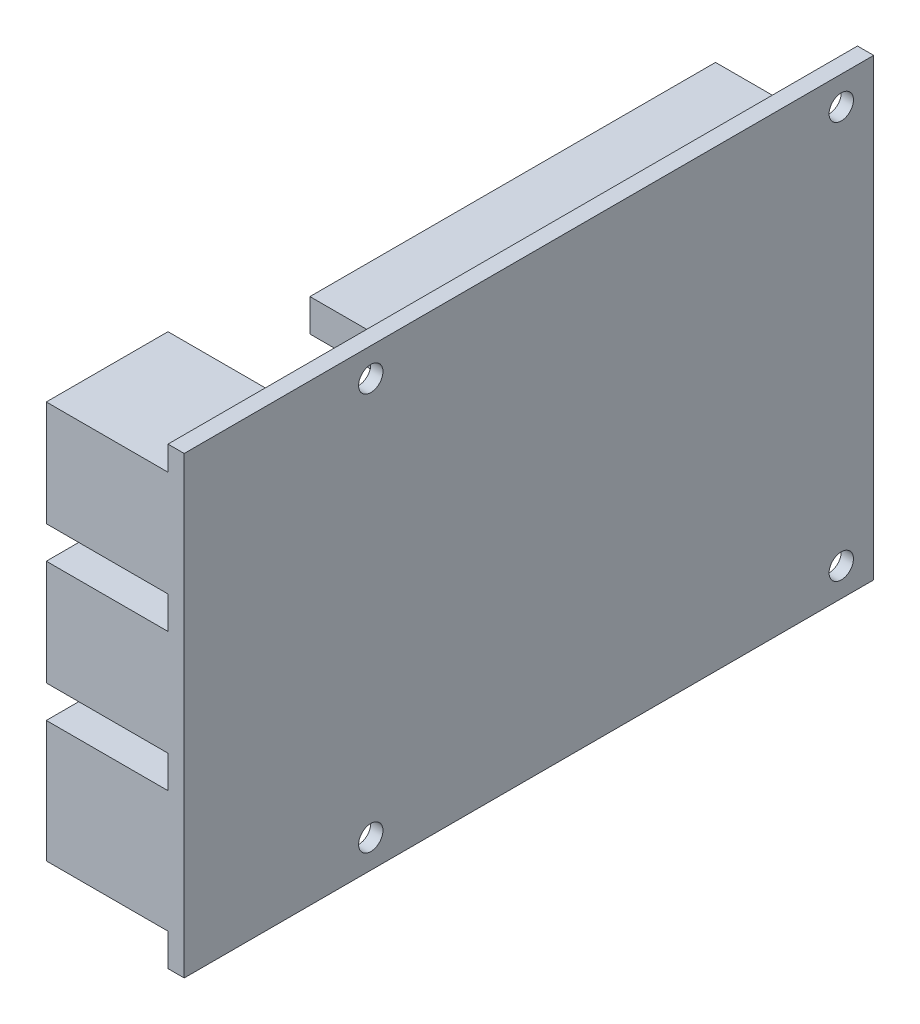
ISO-10303-21;
HEADER;
FILE_DESCRIPTION(('STEP AP214'),'2;1');
FILE_NAME('part.step','',(''),(''),'','','');
FILE_SCHEMA(('AUTOMOTIVE_DESIGN { 1 0 10303 214 1 1 1 1 }'));
ENDSEC;
DATA;
#1=APPLICATION_CONTEXT('core data for automotive mechanical design processes');
#2=APPLICATION_PROTOCOL_DEFINITION('international standard','automotive_design',2000,#1);
#3=PRODUCT_CONTEXT('',#1,'mechanical');
#4=PRODUCT('Part','Part','',(#3));
#5=PRODUCT_RELATED_PRODUCT_CATEGORY('part','',(#4));
#6=PRODUCT_DEFINITION_FORMATION('','',#4);
#7=PRODUCT_DEFINITION_CONTEXT('part definition',#1,'design');
#8=PRODUCT_DEFINITION('design','',#6,#7);
#9=PRODUCT_DEFINITION_SHAPE('','',#8);
#10=(LENGTH_UNIT() NAMED_UNIT(*) SI_UNIT(.MILLI.,.METRE.));
#11=(NAMED_UNIT(*) PLANE_ANGLE_UNIT() SI_UNIT($,.RADIAN.));
#12=(NAMED_UNIT(*) SI_UNIT($,.STERADIAN.) SOLID_ANGLE_UNIT());
#13=UNCERTAINTY_MEASURE_WITH_UNIT(LENGTH_MEASURE(1.E-05),#10,'distance_accuracy_value','');
#14=(GEOMETRIC_REPRESENTATION_CONTEXT(3) GLOBAL_UNCERTAINTY_ASSIGNED_CONTEXT((#13)) GLOBAL_UNIT_ASSIGNED_CONTEXT((#10,
#11,#12)) REPRESENTATION_CONTEXT('',''));
#15=CARTESIAN_POINT('',(0.,0.,0.));
#16=DIRECTION('',(0.,0.,1.));
#17=DIRECTION('',(1.,0.,0.));
#18=AXIS2_PLACEMENT_3D('',#15,#16,#17);
#19=CARTESIAN_POINT('',(0.,0.,0.));
#20=DIRECTION('',(-1.,0.,0.));
#21=DIRECTION('',(0.,0.,1.));
#22=AXIS2_PLACEMENT_3D('',#19,#20,#21);
#23=PLANE('',#22);
#24=CARTESIAN_POINT('',(0.,-24.5,19.5));
#25=DIRECTION('',(-1.,0.,0.));
#26=DIRECTION('',(0.,0.,-1.));
#27=AXIS2_PLACEMENT_3D('',#24,#25,#26);
#28=CIRCLE('',#27,2.5);
#29=CARTESIAN_POINT('',(0.,-24.5,17.));
#30=VERTEX_POINT('',#29);
#31=EDGE_CURVE('E199',#30,#30,#28,.T.);
#32=ORIENTED_EDGE('',*,*,#31,.F.);
#33=EDGE_LOOP('',(#32));
#34=FACE_BOUND('',#33,.T.);
#35=CARTESIAN_POINT('',(0.,-24.5,-38.5));
#36=DIRECTION('',(-1.,0.,0.));
#37=DIRECTION('',(0.,0.,-1.));
#38=AXIS2_PLACEMENT_3D('',#35,#36,#37);
#39=CIRCLE('',#38,2.5);
#40=CARTESIAN_POINT('',(0.,-24.5,-41.));
#41=VERTEX_POINT('',#40);
#42=EDGE_CURVE('E217',#41,#41,#39,.T.);
#43=ORIENTED_EDGE('',*,*,#42,.F.);
#44=EDGE_LOOP('',(#43));
#45=FACE_BOUND('',#44,.T.);
#46=CARTESIAN_POINT('',(0.,24.5,-38.5));
#47=DIRECTION('',(-1.,0.,0.));
#48=DIRECTION('',(0.,0.,1.));
#49=AXIS2_PLACEMENT_3D('',#46,#47,#48);
#50=CIRCLE('',#49,2.5);
#51=CARTESIAN_POINT('',(0.,24.5,-36.));
#52=VERTEX_POINT('',#51);
#53=EDGE_CURVE('E211',#52,#52,#50,.T.);
#54=ORIENTED_EDGE('',*,*,#53,.F.);
#55=EDGE_LOOP('',(#54));
#56=FACE_BOUND('',#55,.T.);
#57=CARTESIAN_POINT('',(0.,24.5,19.5));
#58=DIRECTION('',(-1.,0.,0.));
#59=DIRECTION('',(0.,0.,1.));
#60=AXIS2_PLACEMENT_3D('',#57,#58,#59);
#61=CIRCLE('',#60,2.5);
#62=CARTESIAN_POINT('',(0.,24.5,22.));
#63=VERTEX_POINT('',#62);
#64=EDGE_CURVE('E210',#63,#63,#61,.T.);
#65=ORIENTED_EDGE('',*,*,#64,.F.);
#66=EDGE_LOOP('',(#65));
#67=FACE_BOUND('',#66,.T.);
#68=DIRECTION('',(0.,1.,0.));
#69=VECTOR('',#68,1.);
#70=CARTESIAN_POINT('',(0.,12.,27.5));
#71=LINE('',#70,#69);
#72=CARTESIAN_POINT('',(0.,12.,27.5));
#73=VERTEX_POINT('',#72);
#74=CARTESIAN_POINT('',(0.,25.,27.5));
#75=VERTEX_POINT('',#74);
#76=EDGE_CURVE('E239',#73,#75,#71,.T.);
#77=ORIENTED_EDGE('',*,*,#76,.T.);
#78=DIRECTION('',(0.,0.,-1.));
#79=VECTOR('',#78,1.);
#80=CARTESIAN_POINT('',(0.,25.,42.5));
#81=LINE('',#80,#79);
#82=CARTESIAN_POINT('',(0.,25.,42.5));
#83=VERTEX_POINT('',#82);
#84=EDGE_CURVE('E243',#83,#75,#81,.T.);
#85=ORIENTED_EDGE('',*,*,#84,.F.);
#86=DIRECTION('',(0.,-1.,0.));
#87=VECTOR('',#86,1.);
#88=CARTESIAN_POINT('',(0.,-28.,42.5));
#89=LINE('',#88,#87);
#90=CARTESIAN_POINT('',(0.,28.,42.5));
#91=VERTEX_POINT('',#90);
#92=EDGE_CURVE('E328',#91,#83,#89,.T.);
#93=ORIENTED_EDGE('',*,*,#92,.F.);
#94=DIRECTION('',(0.,0.,1.));
#95=VECTOR('',#94,1.);
#96=CARTESIAN_POINT('',(0.,28.,42.5));
#97=LINE('',#96,#95);
#98=CARTESIAN_POINT('',(0.,28.,-42.5));
#99=VERTEX_POINT('',#98);
#100=EDGE_CURVE('E325',#99,#91,#97,.T.);
#101=ORIENTED_EDGE('',*,*,#100,.F.);
#102=DIRECTION('',(0.,1.,0.));
#103=VECTOR('',#102,1.);
#104=CARTESIAN_POINT('',(0.,-28.,-42.5));
#105=LINE('',#104,#103);
#106=CARTESIAN_POINT('',(0.,-28.,-42.5));
#107=VERTEX_POINT('',#106);
#108=EDGE_CURVE('E311',#107,#99,#105,.T.);
#109=ORIENTED_EDGE('',*,*,#108,.F.);
#110=DIRECTION('',(0.,0.,-1.));
#111=VECTOR('',#110,1.);
#112=CARTESIAN_POINT('',(0.,-28.,42.5));
#113=LINE('',#112,#111);
#114=CARTESIAN_POINT('',(0.,-28.,42.5));
#115=VERTEX_POINT('',#114);
#116=EDGE_CURVE('E316',#115,#107,#113,.T.);
#117=ORIENTED_EDGE('',*,*,#116,.F.);
#118=CARTESIAN_POINT('',(0.,-24.,42.5));
#119=VERTEX_POINT('',#118);
#120=EDGE_CURVE('E327',#119,#115,#89,.T.);
#121=ORIENTED_EDGE('',*,*,#120,.F.);
#122=DIRECTION('',(0.,0.,-1.));
#123=VECTOR('',#122,1.);
#124=CARTESIAN_POINT('',(0.,-24.,42.5));
#125=LINE('',#124,#123);
#126=CARTESIAN_POINT('',(0.,-24.,22.5));
#127=VERTEX_POINT('',#126);
#128=EDGE_CURVE('E287',#119,#127,#125,.T.);
#129=ORIENTED_EDGE('',*,*,#128,.T.);
#130=DIRECTION('',(0.,1.,0.));
#131=VECTOR('',#130,1.);
#132=CARTESIAN_POINT('',(0.,-24.,22.5));
#133=LINE('',#132,#131);
#134=CARTESIAN_POINT('',(0.,-8.99999999999999,22.5));
#135=VERTEX_POINT('',#134);
#136=EDGE_CURVE('E297',#127,#135,#133,.T.);
#137=ORIENTED_EDGE('',*,*,#136,.T.);
#138=DIRECTION('',(0.,0.,-1.));
#139=VECTOR('',#138,1.);
#140=CARTESIAN_POINT('',(0.,-8.99999999999999,42.5));
#141=LINE('',#140,#139);
#142=CARTESIAN_POINT('',(0.,-8.99999999999999,42.5));
#143=VERTEX_POINT('',#142);
#144=EDGE_CURVE('E275',#143,#135,#141,.T.);
#145=ORIENTED_EDGE('',*,*,#144,.F.);
#146=CARTESIAN_POINT('',(0.,-4.99999999999999,42.5));
#147=VERTEX_POINT('',#146);
#148=EDGE_CURVE('E466',#147,#143,#89,.T.);
#149=ORIENTED_EDGE('',*,*,#148,.F.);
#150=DIRECTION('',(0.,0.,-1.));
#151=VECTOR('',#150,1.);
#152=CARTESIAN_POINT('',(0.,-4.99999999999999,42.5));
#153=LINE('',#152,#151);
#154=CARTESIAN_POINT('',(0.,-4.99999999999999,27.5));
#155=VERTEX_POINT('',#154);
#156=EDGE_CURVE('E265',#147,#155,#153,.T.);
#157=ORIENTED_EDGE('',*,*,#156,.T.);
#158=DIRECTION('',(0.,1.,0.));
#159=VECTOR('',#158,1.);
#160=CARTESIAN_POINT('',(0.,-4.99999999999999,27.5));
#161=LINE('',#160,#159);
#162=CARTESIAN_POINT('',(0.,8.00000000000001,27.5));
#163=VERTEX_POINT('',#162);
#164=EDGE_CURVE('E268',#155,#163,#161,.T.);
#165=ORIENTED_EDGE('',*,*,#164,.T.);
#166=DIRECTION('',(0.,0.,-1.));
#167=VECTOR('',#166,1.);
#168=CARTESIAN_POINT('',(0.,8.00000000000001,42.5));
#169=LINE('',#168,#167);
#170=CARTESIAN_POINT('',(0.,8.00000000000001,42.5));
#171=VERTEX_POINT('',#170);
#172=EDGE_CURVE('E272',#171,#163,#169,.T.);
#173=ORIENTED_EDGE('',*,*,#172,.F.);
#174=CARTESIAN_POINT('',(0.,12.,42.5));
#175=VERTEX_POINT('',#174);
#176=EDGE_CURVE('E331',#175,#171,#89,.T.);
#177=ORIENTED_EDGE('',*,*,#176,.F.);
#178=DIRECTION('',(0.,0.,-1.));
#179=VECTOR('',#178,1.);
#180=CARTESIAN_POINT('',(0.,12.,42.5));
#181=LINE('',#180,#179);
#182=EDGE_CURVE('E60',#175,#73,#181,.T.);
#183=ORIENTED_EDGE('',*,*,#182,.T.);
#184=EDGE_LOOP('',(#77,#85,#93,#101,#109,#117,#121,#129,#137,#145,#149,#157,#165,#173,#177,#183));
#185=FACE_BOUND('',#184,.T.);
#186=DIRECTION('',(0.,0.,-1.));
#187=VECTOR('',#186,1.);
#188=CARTESIAN_POINT('',(0.,26.,16.));
#189=LINE('',#188,#187);
#190=CARTESIAN_POINT('',(0.,26.,16.));
#191=VERTEX_POINT('',#190);
#192=CARTESIAN_POINT('',(0.,26.,-34.));
#193=VERTEX_POINT('',#192);
#194=EDGE_CURVE('E490',#191,#193,#189,.T.);
#195=ORIENTED_EDGE('',*,*,#194,.F.);
#196=DIRECTION('',(0.,1.,0.));
#197=VECTOR('',#196,1.);
#198=CARTESIAN_POINT('',(0.,22.,16.));
#199=LINE('',#198,#197);
#200=CARTESIAN_POINT('',(0.,22.,16.));
#201=VERTEX_POINT('',#200);
#202=EDGE_CURVE('E197',#201,#191,#199,.T.);
#203=ORIENTED_EDGE('',*,*,#202,.F.);
#204=DIRECTION('',(0.,0.,1.));
#205=VECTOR('',#204,1.);
#206=CARTESIAN_POINT('',(0.,22.,16.));
#207=LINE('',#206,#205);
#208=CARTESIAN_POINT('',(0.,22.,-34.));
#209=VERTEX_POINT('',#208);
#210=EDGE_CURVE('E193',#209,#201,#207,.T.);
#211=ORIENTED_EDGE('',*,*,#210,.F.);
#212=DIRECTION('',(0.,-1.,0.));
#213=VECTOR('',#212,1.);
#214=CARTESIAN_POINT('',(0.,22.,-34.));
#215=LINE('',#214,#213);
#216=EDGE_CURVE('E492',#193,#209,#215,.T.);
#217=ORIENTED_EDGE('',*,*,#216,.F.);
#218=EDGE_LOOP('',(#195,#203,#211,#217));
#219=FACE_BOUND('',#218,.T.);
#220=ADVANCED_FACE('F35',(#34,#45,#56,#67,#185,#219),#23,.T.);
#221=CARTESIAN_POINT('',(15.,24.5,-38.5));
#222=DIRECTION('',(-1.,0.,0.));
#223=DIRECTION('',(0.,0.,1.));
#224=AXIS2_PLACEMENT_3D('',#221,#222,#223);
#225=CYLINDRICAL_SURFACE('',#224,1.5);
#226=CARTESIAN_POINT('',(2.,24.5,-38.5));
#227=DIRECTION('',(-1.,0.,0.));
#228=DIRECTION('',(0.,0.,1.));
#229=AXIS2_PLACEMENT_3D('',#226,#227,#228);
#230=CIRCLE('',#229,1.5);
#231=CARTESIAN_POINT('',(2.,24.5,-37.));
#232=VERTEX_POINT('',#231);
#233=EDGE_CURVE('E340',#232,#232,#230,.T.);
#234=ORIENTED_EDGE('',*,*,#233,.F.);
#235=EDGE_LOOP('',(#234));
#236=FACE_BOUND('',#235,.T.);
#237=CARTESIAN_POINT('',(0.5,24.5,-38.5));
#238=DIRECTION('',(-1.,0.,0.));
#239=DIRECTION('',(0.,0.,1.));
#240=AXIS2_PLACEMENT_3D('',#237,#238,#239);
#241=CIRCLE('',#240,1.5);
#242=CARTESIAN_POINT('',(0.5,24.5,-37.));
#243=VERTEX_POINT('',#242);
#244=EDGE_CURVE('E39',#243,#243,#241,.F.);
#245=ORIENTED_EDGE('',*,*,#244,.F.);
#246=EDGE_LOOP('',(#245));
#247=FACE_BOUND('',#246,.T.);
#248=ADVANCED_FACE('F364',(#236,#247),#225,.F.);
#249=CARTESIAN_POINT('',(15.,24.5,19.5));
#250=DIRECTION('',(-1.,0.,0.));
#251=DIRECTION('',(0.,0.,1.));
#252=AXIS2_PLACEMENT_3D('',#249,#250,#251);
#253=CYLINDRICAL_SURFACE('',#252,1.5);
#254=CARTESIAN_POINT('',(2.,24.5,19.5));
#255=DIRECTION('',(-1.,0.,0.));
#256=DIRECTION('',(0.,0.,1.));
#257=AXIS2_PLACEMENT_3D('',#254,#255,#256);
#258=CIRCLE('',#257,1.5);
#259=CARTESIAN_POINT('',(2.,24.5,21.));
#260=VERTEX_POINT('',#259);
#261=EDGE_CURVE('E231',#260,#260,#258,.T.);
#262=ORIENTED_EDGE('',*,*,#261,.F.);
#263=EDGE_LOOP('',(#262));
#264=FACE_BOUND('',#263,.T.);
#265=CARTESIAN_POINT('',(0.5,24.5,19.5));
#266=DIRECTION('',(-1.,0.,0.));
#267=DIRECTION('',(0.,0.,1.));
#268=AXIS2_PLACEMENT_3D('',#265,#266,#267);
#269=CIRCLE('',#268,1.5);
#270=CARTESIAN_POINT('',(0.5,24.5,21.));
#271=VERTEX_POINT('',#270);
#272=EDGE_CURVE('E225',#271,#271,#269,.F.);
#273=ORIENTED_EDGE('',*,*,#272,.F.);
#274=EDGE_LOOP('',(#273));
#275=FACE_BOUND('',#274,.T.);
#276=ADVANCED_FACE('F366',(#264,#275),#253,.F.);
#277=CARTESIAN_POINT('',(2.,-28.,-42.5));
#278=DIRECTION('',(0.,0.,1.));
#279=DIRECTION('',(1.,0.,0.));
#280=AXIS2_PLACEMENT_3D('',#277,#278,#279);
#281=PLANE('',#280);
#282=ORIENTED_EDGE('',*,*,#108,.T.);
#283=DIRECTION('',(-1.,0.,0.));
#284=VECTOR('',#283,1.);
#285=CARTESIAN_POINT('',(2.,28.,-42.5));
#286=LINE('',#285,#284);
#287=CARTESIAN_POINT('',(2.,28.,-42.5));
#288=VERTEX_POINT('',#287);
#289=EDGE_CURVE('E11',#288,#99,#286,.T.);
#290=ORIENTED_EDGE('',*,*,#289,.F.);
#291=DIRECTION('',(0.,1.,0.));
#292=VECTOR('',#291,1.);
#293=CARTESIAN_POINT('',(2.,-28.,-42.5));
#294=LINE('',#293,#292);
#295=CARTESIAN_POINT('',(2.,-28.,-42.5));
#296=VERTEX_POINT('',#295);
#297=EDGE_CURVE('E312',#296,#288,#294,.T.);
#298=ORIENTED_EDGE('',*,*,#297,.F.);
#299=DIRECTION('',(-1.,0.,0.));
#300=VECTOR('',#299,1.);
#301=CARTESIAN_POINT('',(2.,-28.,-42.5));
#302=LINE('',#301,#300);
#303=EDGE_CURVE('E322',#296,#107,#302,.T.);
#304=ORIENTED_EDGE('',*,*,#303,.T.);
#305=EDGE_LOOP('',(#282,#290,#298,#304));
#306=FACE_BOUND('',#305,.T.);
#307=ADVANCED_FACE('F37',(#306),#281,.F.);
#308=CARTESIAN_POINT('',(2.,28.,42.5));
#309=DIRECTION('',(0.,-1.,0.));
#310=DIRECTION('',(0.,0.,-1.));
#311=AXIS2_PLACEMENT_3D('',#308,#309,#310);
#312=PLANE('',#311);
#313=ORIENTED_EDGE('',*,*,#100,.T.);
#314=DIRECTION('',(-1.,0.,0.));
#315=VECTOR('',#314,1.);
#316=CARTESIAN_POINT('',(2.,28.,42.5));
#317=LINE('',#316,#315);
#318=CARTESIAN_POINT('',(2.,28.,42.5));
#319=VERTEX_POINT('',#318);
#320=EDGE_CURVE('E44',#319,#91,#317,.T.);
#321=ORIENTED_EDGE('',*,*,#320,.F.);
#322=DIRECTION('',(0.,0.,1.));
#323=VECTOR('',#322,1.);
#324=CARTESIAN_POINT('',(2.,28.,42.5));
#325=LINE('',#324,#323);
#326=EDGE_CURVE('E315',#288,#319,#325,.T.);
#327=ORIENTED_EDGE('',*,*,#326,.F.);
#328=ORIENTED_EDGE('',*,*,#289,.T.);
#329=EDGE_LOOP('',(#313,#321,#327,#328));
#330=FACE_BOUND('',#329,.T.);
#331=ADVANCED_FACE('F439',(#330),#312,.F.);
#332=CARTESIAN_POINT('',(2.,-28.,42.5));
#333=DIRECTION('',(0.,0.,-1.));
#334=DIRECTION('',(-1.,0.,0.));
#335=AXIS2_PLACEMENT_3D('',#332,#333,#334);
#336=PLANE('',#335);
#337=ORIENTED_EDGE('',*,*,#92,.T.);
#338=DIRECTION('',(1.,0.,0.));
#339=VECTOR('',#338,1.);
#340=CARTESIAN_POINT('',(-15.,25.,42.5));
#341=LINE('',#340,#339);
#342=CARTESIAN_POINT('',(-15.,25.,42.5));
#343=VERTEX_POINT('',#342);
#344=EDGE_CURVE('E235',#343,#83,#341,.T.);
#345=ORIENTED_EDGE('',*,*,#344,.F.);
#346=DIRECTION('',(0.,1.,0.));
#347=VECTOR('',#346,1.);
#348=CARTESIAN_POINT('',(-15.,12.,42.5));
#349=LINE('',#348,#347);
#350=CARTESIAN_POINT('',(-15.,12.,42.5));
#351=VERTEX_POINT('',#350);
#352=EDGE_CURVE('E237',#351,#343,#349,.T.);
#353=ORIENTED_EDGE('',*,*,#352,.F.);
#354=DIRECTION('',(1.,0.,0.));
#355=VECTOR('',#354,1.);
#356=CARTESIAN_POINT('',(-15.,12.,42.5));
#357=LINE('',#356,#355);
#358=EDGE_CURVE('E233',#351,#175,#357,.T.);
#359=ORIENTED_EDGE('',*,*,#358,.T.);
#360=ORIENTED_EDGE('',*,*,#176,.T.);
#361=DIRECTION('',(1.,0.,0.));
#362=VECTOR('',#361,1.);
#363=CARTESIAN_POINT('',(-15.,8.00000000000001,42.5));
#364=LINE('',#363,#362);
#365=CARTESIAN_POINT('',(-15.,8.00000000000001,42.5));
#366=VERTEX_POINT('',#365);
#367=EDGE_CURVE('E261',#366,#171,#364,.T.);
#368=ORIENTED_EDGE('',*,*,#367,.F.);
#369=DIRECTION('',(0.,1.,0.));
#370=VECTOR('',#369,1.);
#371=CARTESIAN_POINT('',(-15.,-4.99999999999999,42.5));
#372=LINE('',#371,#370);
#373=CARTESIAN_POINT('',(-15.,-4.99999999999999,42.5));
#374=VERTEX_POINT('',#373);
#375=EDGE_CURVE('E264',#374,#366,#372,.T.);
#376=ORIENTED_EDGE('',*,*,#375,.F.);
#377=DIRECTION('',(1.,0.,0.));
#378=VECTOR('',#377,1.);
#379=CARTESIAN_POINT('',(-15.,-4.99999999999999,42.5));
#380=LINE('',#379,#378);
#381=EDGE_CURVE('E258',#374,#147,#380,.T.);
#382=ORIENTED_EDGE('',*,*,#381,.T.);
#383=ORIENTED_EDGE('',*,*,#148,.T.);
#384=DIRECTION('',(1.,0.,0.));
#385=VECTOR('',#384,1.);
#386=CARTESIAN_POINT('',(-15.,-8.99999999999999,42.5));
#387=LINE('',#386,#385);
#388=CARTESIAN_POINT('',(-15.,-8.99999999999999,42.5));
#389=VERTEX_POINT('',#388);
#390=EDGE_CURVE('E295',#389,#143,#387,.T.);
#391=ORIENTED_EDGE('',*,*,#390,.F.);
#392=DIRECTION('',(0.,1.,0.));
#393=VECTOR('',#392,1.);
#394=CARTESIAN_POINT('',(-15.,-24.,42.5));
#395=LINE('',#394,#393);
#396=CARTESIAN_POINT('',(-15.,-24.,42.5));
#397=VERTEX_POINT('',#396);
#398=EDGE_CURVE('E293',#397,#389,#395,.T.);
#399=ORIENTED_EDGE('',*,*,#398,.F.);
#400=DIRECTION('',(1.,0.,0.));
#401=VECTOR('',#400,1.);
#402=CARTESIAN_POINT('',(-15.,-24.,42.5));
#403=LINE('',#402,#401);
#404=EDGE_CURVE('E304',#397,#119,#403,.T.);
#405=ORIENTED_EDGE('',*,*,#404,.T.);
#406=ORIENTED_EDGE('',*,*,#120,.T.);
#407=DIRECTION('',(-1.,0.,0.));
#408=VECTOR('',#407,1.);
#409=CARTESIAN_POINT('',(2.,-28.,42.5));
#410=LINE('',#409,#408);
#411=CARTESIAN_POINT('',(2.,-28.,42.5));
#412=VERTEX_POINT('',#411);
#413=EDGE_CURVE('E335',#412,#115,#410,.T.);
#414=ORIENTED_EDGE('',*,*,#413,.F.);
#415=DIRECTION('',(0.,-1.,0.));
#416=VECTOR('',#415,1.);
#417=CARTESIAN_POINT('',(2.,-28.,42.5));
#418=LINE('',#417,#416);
#419=EDGE_CURVE('E318',#319,#412,#418,.T.);
#420=ORIENTED_EDGE('',*,*,#419,.F.);
#421=ORIENTED_EDGE('',*,*,#320,.T.);
#422=EDGE_LOOP('',(#337,#345,#353,#359,#360,#368,#376,#382,#383,#391,#399,#405,#406,#414,#420,#421));
#423=FACE_BOUND('',#422,.T.);
#424=ADVANCED_FACE('F436',(#423),#336,.F.);
#425=CARTESIAN_POINT('',(2.,-28.,42.5));
#426=DIRECTION('',(0.,1.,0.));
#427=DIRECTION('',(0.,0.,1.));
#428=AXIS2_PLACEMENT_3D('',#425,#426,#427);
#429=PLANE('',#428);
#430=ORIENTED_EDGE('',*,*,#116,.T.);
#431=ORIENTED_EDGE('',*,*,#303,.F.);
#432=DIRECTION('',(0.,0.,-1.));
#433=VECTOR('',#432,1.);
#434=CARTESIAN_POINT('',(2.,-28.,42.5));
#435=LINE('',#434,#433);
#436=EDGE_CURVE('E320',#412,#296,#435,.T.);
#437=ORIENTED_EDGE('',*,*,#436,.F.);
#438=ORIENTED_EDGE('',*,*,#413,.T.);
#439=EDGE_LOOP('',(#430,#431,#437,#438));
#440=FACE_BOUND('',#439,.T.);
#441=ADVANCED_FACE('F431',(#440),#429,.F.);
#442=CARTESIAN_POINT('',(2.,0.,0.));
#443=DIRECTION('',(-1.,0.,0.));
#444=DIRECTION('',(0.,0.,1.));
#445=AXIS2_PLACEMENT_3D('',#442,#443,#444);
#446=PLANE('',#445);
#447=ORIENTED_EDGE('',*,*,#261,.T.);
#448=EDGE_LOOP('',(#447));
#449=FACE_BOUND('',#448,.T.);
#450=CARTESIAN_POINT('',(2.,-24.5,-38.5));
#451=DIRECTION('',(-1.,0.,0.));
#452=DIRECTION('',(0.,0.,1.));
#453=AXIS2_PLACEMENT_3D('',#450,#451,#452);
#454=CIRCLE('',#453,1.5);
#455=CARTESIAN_POINT('',(2.,-24.5,-37.));
#456=VERTEX_POINT('',#455);
#457=EDGE_CURVE('E346',#456,#456,#454,.T.);
#458=ORIENTED_EDGE('',*,*,#457,.T.);
#459=EDGE_LOOP('',(#458));
#460=FACE_BOUND('',#459,.T.);
#461=CARTESIAN_POINT('',(2.,-24.5,19.5));
#462=DIRECTION('',(-1.,0.,0.));
#463=DIRECTION('',(0.,0.,1.));
#464=AXIS2_PLACEMENT_3D('',#461,#462,#463);
#465=CIRCLE('',#464,1.5);
#466=CARTESIAN_POINT('',(2.,-24.5,21.));
#467=VERTEX_POINT('',#466);
#468=EDGE_CURVE('E343',#467,#467,#465,.T.);
#469=ORIENTED_EDGE('',*,*,#468,.T.);
#470=EDGE_LOOP('',(#469));
#471=FACE_BOUND('',#470,.T.);
#472=ORIENTED_EDGE('',*,*,#233,.T.);
#473=EDGE_LOOP('',(#472));
#474=FACE_BOUND('',#473,.T.);
#475=ORIENTED_EDGE('',*,*,#297,.T.);
#476=ORIENTED_EDGE('',*,*,#326,.T.);
#477=ORIENTED_EDGE('',*,*,#419,.T.);
#478=ORIENTED_EDGE('',*,*,#436,.T.);
#479=EDGE_LOOP('',(#475,#476,#477,#478));
#480=FACE_BOUND('',#479,.T.);
#481=ADVANCED_FACE('F428',(#449,#460,#471,#474,#480),#446,.F.);
#482=CARTESIAN_POINT('',(-15.,-8.99999999999999,42.5));
#483=DIRECTION('',(0.,-1.,0.));
#484=DIRECTION('',(0.,0.,-1.));
#485=AXIS2_PLACEMENT_3D('',#482,#483,#484);
#486=PLANE('',#485);
#487=ORIENTED_EDGE('',*,*,#144,.T.);
#488=DIRECTION('',(1.,0.,0.));
#489=VECTOR('',#488,1.);
#490=CARTESIAN_POINT('',(-15.,-8.99999999999999,22.5));
#491=LINE('',#490,#489);
#492=CARTESIAN_POINT('',(-15.,-8.99999999999999,22.5));
#493=VERTEX_POINT('',#492);
#494=EDGE_CURVE('E308',#493,#135,#491,.T.);
#495=ORIENTED_EDGE('',*,*,#494,.F.);
#496=DIRECTION('',(0.,0.,-1.));
#497=VECTOR('',#496,1.);
#498=CARTESIAN_POINT('',(-15.,-8.99999999999999,42.5));
#499=LINE('',#498,#497);
#500=EDGE_CURVE('E284',#389,#493,#499,.T.);
#501=ORIENTED_EDGE('',*,*,#500,.F.);
#502=ORIENTED_EDGE('',*,*,#390,.T.);
#503=EDGE_LOOP('',(#487,#495,#501,#502));
#504=FACE_BOUND('',#503,.T.);
#505=ADVANCED_FACE('F424',(#504),#486,.F.);
#506=CARTESIAN_POINT('',(-15.,-24.,22.5));
#507=DIRECTION('',(0.,0.,-1.));
#508=DIRECTION('',(-1.,0.,0.));
#509=AXIS2_PLACEMENT_3D('',#506,#507,#508);
#510=PLANE('',#509);
#511=ORIENTED_EDGE('',*,*,#136,.F.);
#512=DIRECTION('',(1.,0.,0.));
#513=VECTOR('',#512,1.);
#514=CARTESIAN_POINT('',(-15.,-24.,22.5));
#515=LINE('',#514,#513);
#516=CARTESIAN_POINT('',(-15.,-24.,22.5));
#517=VERTEX_POINT('',#516);
#518=EDGE_CURVE('E306',#517,#127,#515,.T.);
#519=ORIENTED_EDGE('',*,*,#518,.F.);
#520=DIRECTION('',(0.,1.,0.));
#521=VECTOR('',#520,1.);
#522=CARTESIAN_POINT('',(-15.,-24.,22.5));
#523=LINE('',#522,#521);
#524=EDGE_CURVE('E286',#517,#493,#523,.T.);
#525=ORIENTED_EDGE('',*,*,#524,.T.);
#526=ORIENTED_EDGE('',*,*,#494,.T.);
#527=EDGE_LOOP('',(#511,#519,#525,#526));
#528=FACE_BOUND('',#527,.T.);
#529=ADVANCED_FACE('F420',(#528),#510,.T.);
#530=CARTESIAN_POINT('',(-15.,-24.,42.5));
#531=DIRECTION('',(0.,-1.,0.));
#532=DIRECTION('',(0.,0.,-1.));
#533=AXIS2_PLACEMENT_3D('',#530,#531,#532);
#534=PLANE('',#533);
#535=ORIENTED_EDGE('',*,*,#128,.F.);
#536=ORIENTED_EDGE('',*,*,#404,.F.);
#537=DIRECTION('',(0.,0.,-1.));
#538=VECTOR('',#537,1.);
#539=CARTESIAN_POINT('',(-15.,-24.,42.5));
#540=LINE('',#539,#538);
#541=EDGE_CURVE('E290',#397,#517,#540,.T.);
#542=ORIENTED_EDGE('',*,*,#541,.T.);
#543=ORIENTED_EDGE('',*,*,#518,.T.);
#544=EDGE_LOOP('',(#535,#536,#542,#543));
#545=FACE_BOUND('',#544,.T.);
#546=ADVANCED_FACE('F416',(#545),#534,.T.);
#547=CARTESIAN_POINT('',(-15.,0.,0.));
#548=DIRECTION('',(1.,0.,0.));
#549=DIRECTION('',(0.,0.,-1.));
#550=AXIS2_PLACEMENT_3D('',#547,#548,#549);
#551=PLANE('',#550);
#552=ORIENTED_EDGE('',*,*,#500,.T.);
#553=ORIENTED_EDGE('',*,*,#524,.F.);
#554=ORIENTED_EDGE('',*,*,#541,.F.);
#555=ORIENTED_EDGE('',*,*,#398,.T.);
#556=EDGE_LOOP('',(#552,#553,#554,#555));
#557=FACE_BOUND('',#556,.T.);
#558=ADVANCED_FACE('F402',(#557),#551,.F.);
#559=CARTESIAN_POINT('',(-15.,8.00000000000001,42.5));
#560=DIRECTION('',(0.,-1.,0.));
#561=DIRECTION('',(0.,0.,-1.));
#562=AXIS2_PLACEMENT_3D('',#559,#560,#561);
#563=PLANE('',#562);
#564=ORIENTED_EDGE('',*,*,#172,.T.);
#565=DIRECTION('',(1.,0.,0.));
#566=VECTOR('',#565,1.);
#567=CARTESIAN_POINT('',(-15.,8.00000000000001,27.5));
#568=LINE('',#567,#566);
#569=CARTESIAN_POINT('',(-15.,8.00000000000001,27.5));
#570=VERTEX_POINT('',#569);
#571=EDGE_CURVE('E246',#570,#163,#568,.T.);
#572=ORIENTED_EDGE('',*,*,#571,.F.);
#573=DIRECTION('',(0.,0.,-1.));
#574=VECTOR('',#573,1.);
#575=CARTESIAN_POINT('',(-15.,8.00000000000001,42.5));
#576=LINE('',#575,#574);
#577=EDGE_CURVE('E269',#366,#570,#576,.T.);
#578=ORIENTED_EDGE('',*,*,#577,.F.);
#579=ORIENTED_EDGE('',*,*,#367,.T.);
#580=EDGE_LOOP('',(#564,#572,#578,#579));
#581=FACE_BOUND('',#580,.T.);
#582=ADVANCED_FACE('F398',(#581),#563,.F.);
#583=CARTESIAN_POINT('',(-15.,-4.99999999999999,27.5));
#584=DIRECTION('',(0.,0.,-1.));
#585=DIRECTION('',(0.,1.,0.));
#586=AXIS2_PLACEMENT_3D('',#583,#584,#585);
#587=PLANE('',#586);
#588=ORIENTED_EDGE('',*,*,#164,.F.);
#589=DIRECTION('',(1.,0.,0.));
#590=VECTOR('',#589,1.);
#591=CARTESIAN_POINT('',(-15.,-4.99999999999999,27.5));
#592=LINE('',#591,#590);
#593=CARTESIAN_POINT('',(-15.,-4.99999999999999,27.5));
#594=VERTEX_POINT('',#593);
#595=EDGE_CURVE('E256',#594,#155,#592,.T.);
#596=ORIENTED_EDGE('',*,*,#595,.F.);
#597=DIRECTION('',(0.,1.,0.));
#598=VECTOR('',#597,1.);
#599=CARTESIAN_POINT('',(-15.,-4.99999999999999,27.5));
#600=LINE('',#599,#598);
#601=EDGE_CURVE('E280',#594,#570,#600,.T.);
#602=ORIENTED_EDGE('',*,*,#601,.T.);
#603=ORIENTED_EDGE('',*,*,#571,.T.);
#604=EDGE_LOOP('',(#588,#596,#602,#603));
#605=FACE_BOUND('',#604,.T.);
#606=ADVANCED_FACE('F401',(#605),#587,.T.);
#607=CARTESIAN_POINT('',(-15.,-4.99999999999999,42.5));
#608=DIRECTION('',(0.,-1.,0.));
#609=DIRECTION('',(0.,0.,-1.));
#610=AXIS2_PLACEMENT_3D('',#607,#608,#609);
#611=PLANE('',#610);
#612=ORIENTED_EDGE('',*,*,#156,.F.);
#613=ORIENTED_EDGE('',*,*,#381,.F.);
#614=DIRECTION('',(0.,0.,-1.));
#615=VECTOR('',#614,1.);
#616=CARTESIAN_POINT('',(-15.,-4.99999999999999,42.5));
#617=LINE('',#616,#615);
#618=EDGE_CURVE('E277',#374,#594,#617,.T.);
#619=ORIENTED_EDGE('',*,*,#618,.T.);
#620=ORIENTED_EDGE('',*,*,#595,.T.);
#621=EDGE_LOOP('',(#612,#613,#619,#620));
#622=FACE_BOUND('',#621,.T.);
#623=ADVANCED_FACE('F406',(#622),#611,.T.);
#624=CARTESIAN_POINT('',(-15.,0.,0.));
#625=DIRECTION('',(1.,0.,0.));
#626=DIRECTION('',(0.,0.,-1.));
#627=AXIS2_PLACEMENT_3D('',#624,#625,#626);
#628=PLANE('',#627);
#629=ORIENTED_EDGE('',*,*,#577,.T.);
#630=ORIENTED_EDGE('',*,*,#601,.F.);
#631=ORIENTED_EDGE('',*,*,#618,.F.);
#632=ORIENTED_EDGE('',*,*,#375,.T.);
#633=EDGE_LOOP('',(#629,#630,#631,#632));
#634=FACE_BOUND('',#633,.T.);
#635=ADVANCED_FACE('F385',(#634),#628,.F.);
#636=CARTESIAN_POINT('',(-15.,25.,42.5));
#637=DIRECTION('',(0.,-1.,0.));
#638=DIRECTION('',(0.,0.,-1.));
#639=AXIS2_PLACEMENT_3D('',#636,#637,#638);
#640=PLANE('',#639);
#641=ORIENTED_EDGE('',*,*,#84,.T.);
#642=DIRECTION('',(1.,0.,0.));
#643=VECTOR('',#642,1.);
#644=CARTESIAN_POINT('',(-15.,25.,27.5));
#645=LINE('',#644,#643);
#646=CARTESIAN_POINT('',(-15.,25.,27.5));
#647=VERTEX_POINT('',#646);
#648=EDGE_CURVE('E228',#647,#75,#645,.T.);
#649=ORIENTED_EDGE('',*,*,#648,.F.);
#650=DIRECTION('',(0.,0.,-1.));
#651=VECTOR('',#650,1.);
#652=CARTESIAN_POINT('',(-15.,25.,42.5));
#653=LINE('',#652,#651);
#654=EDGE_CURVE('E240',#343,#647,#653,.T.);
#655=ORIENTED_EDGE('',*,*,#654,.F.);
#656=ORIENTED_EDGE('',*,*,#344,.T.);
#657=EDGE_LOOP('',(#641,#649,#655,#656));
#658=FACE_BOUND('',#657,.T.);
#659=ADVANCED_FACE('F381',(#658),#640,.F.);
#660=CARTESIAN_POINT('',(-15.,12.,27.5));
#661=DIRECTION('',(0.,0.,-1.));
#662=DIRECTION('',(0.,1.,0.));
#663=AXIS2_PLACEMENT_3D('',#660,#661,#662);
#664=PLANE('',#663);
#665=ORIENTED_EDGE('',*,*,#76,.F.);
#666=DIRECTION('',(1.,0.,0.));
#667=VECTOR('',#666,1.);
#668=CARTESIAN_POINT('',(-15.,12.,27.5));
#669=LINE('',#668,#667);
#670=CARTESIAN_POINT('',(-15.,12.,27.5));
#671=VERTEX_POINT('',#670);
#672=EDGE_CURVE('E230',#671,#73,#669,.T.);
#673=ORIENTED_EDGE('',*,*,#672,.F.);
#674=DIRECTION('',(0.,1.,0.));
#675=VECTOR('',#674,1.);
#676=CARTESIAN_POINT('',(-15.,12.,27.5));
#677=LINE('',#676,#675);
#678=EDGE_CURVE('E251',#671,#647,#677,.T.);
#679=ORIENTED_EDGE('',*,*,#678,.T.);
#680=ORIENTED_EDGE('',*,*,#648,.T.);
#681=EDGE_LOOP('',(#665,#673,#679,#680));
#682=FACE_BOUND('',#681,.T.);
#683=ADVANCED_FACE('F384',(#682),#664,.T.);
#684=CARTESIAN_POINT('',(-15.,12.,42.5));
#685=DIRECTION('',(0.,-1.,0.));
#686=DIRECTION('',(0.,0.,-1.));
#687=AXIS2_PLACEMENT_3D('',#684,#685,#686);
#688=PLANE('',#687);
#689=ORIENTED_EDGE('',*,*,#182,.F.);
#690=ORIENTED_EDGE('',*,*,#358,.F.);
#691=DIRECTION('',(0.,0.,-1.));
#692=VECTOR('',#691,1.);
#693=CARTESIAN_POINT('',(-15.,12.,42.5));
#694=LINE('',#693,#692);
#695=EDGE_CURVE('E248',#351,#671,#694,.T.);
#696=ORIENTED_EDGE('',*,*,#695,.T.);
#697=ORIENTED_EDGE('',*,*,#672,.T.);
#698=EDGE_LOOP('',(#689,#690,#696,#697));
#699=FACE_BOUND('',#698,.T.);
#700=ADVANCED_FACE('F389',(#699),#688,.T.);
#701=CARTESIAN_POINT('',(-15.,0.,0.));
#702=DIRECTION('',(1.,0.,0.));
#703=DIRECTION('',(0.,0.,-1.));
#704=AXIS2_PLACEMENT_3D('',#701,#702,#703);
#705=PLANE('',#704);
#706=ORIENTED_EDGE('',*,*,#654,.T.);
#707=ORIENTED_EDGE('',*,*,#678,.F.);
#708=ORIENTED_EDGE('',*,*,#695,.F.);
#709=ORIENTED_EDGE('',*,*,#352,.T.);
#710=EDGE_LOOP('',(#706,#707,#708,#709));
#711=FACE_BOUND('',#710,.T.);
#712=ADVANCED_FACE('F393',(#711),#705,.F.);
#713=CARTESIAN_POINT('',(15.,-24.5,19.5));
#714=DIRECTION('',(-1.,0.,0.));
#715=DIRECTION('',(0.,0.,1.));
#716=AXIS2_PLACEMENT_3D('',#713,#714,#715);
#717=CYLINDRICAL_SURFACE('',#716,1.5);
#718=CARTESIAN_POINT('',(0.5,-24.5,19.5));
#719=DIRECTION('',(1.,0.,0.));
#720=DIRECTION('',(0.,0.,-1.));
#721=AXIS2_PLACEMENT_3D('',#718,#719,#720);
#722=CIRCLE('',#721,1.5);
#723=CARTESIAN_POINT('',(0.5,-24.5,18.));
#724=VERTEX_POINT('',#723);
#725=EDGE_CURVE('E355',#724,#724,#722,.F.);
#726=ORIENTED_EDGE('',*,*,#725,.T.);
#727=EDGE_LOOP('',(#726));
#728=FACE_BOUND('',#727,.T.);
#729=ORIENTED_EDGE('',*,*,#468,.F.);
#730=EDGE_LOOP('',(#729));
#731=FACE_BOUND('',#730,.T.);
#732=ADVANCED_FACE('F396',(#728,#731),#717,.F.);
#733=CARTESIAN_POINT('',(15.,-24.5,-38.5));
#734=DIRECTION('',(-1.,0.,0.));
#735=DIRECTION('',(0.,0.,1.));
#736=AXIS2_PLACEMENT_3D('',#733,#734,#735);
#737=CYLINDRICAL_SURFACE('',#736,1.5);
#738=CARTESIAN_POINT('',(0.5,-24.5,-38.5));
#739=DIRECTION('',(1.,0.,0.));
#740=DIRECTION('',(0.,0.,-1.));
#741=AXIS2_PLACEMENT_3D('',#738,#739,#740);
#742=CIRCLE('',#741,1.5);
#743=CARTESIAN_POINT('',(0.5,-24.5,-40.));
#744=VERTEX_POINT('',#743);
#745=EDGE_CURVE('E353',#744,#744,#742,.F.);
#746=ORIENTED_EDGE('',*,*,#745,.T.);
#747=EDGE_LOOP('',(#746));
#748=FACE_BOUND('',#747,.T.);
#749=ORIENTED_EDGE('',*,*,#457,.F.);
#750=EDGE_LOOP('',(#749));
#751=FACE_BOUND('',#750,.T.);
#752=ADVANCED_FACE('F380',(#748,#751),#737,.F.);
#753=CARTESIAN_POINT('',(0.5,24.5,19.5));
#754=DIRECTION('',(-1.,0.,0.));
#755=DIRECTION('',(0.,0.,1.));
#756=AXIS2_PLACEMENT_3D('',#753,#754,#755);
#757=PLANE('',#756);
#758=CARTESIAN_POINT('',(0.5,24.5,19.5));
#759=DIRECTION('',(-1.,0.,0.));
#760=DIRECTION('',(0.,0.,1.));
#761=AXIS2_PLACEMENT_3D('',#758,#759,#760);
#762=CIRCLE('',#761,2.5);
#763=CARTESIAN_POINT('',(0.5,24.5,22.));
#764=VERTEX_POINT('',#763);
#765=EDGE_CURVE('E222',#764,#764,#762,.T.);
#766=ORIENTED_EDGE('',*,*,#765,.T.);
#767=EDGE_LOOP('',(#766));
#768=FACE_BOUND('',#767,.T.);
#769=ORIENTED_EDGE('',*,*,#272,.T.);
#770=EDGE_LOOP('',(#769));
#771=FACE_BOUND('',#770,.T.);
#772=ADVANCED_FACE('F541',(#768,#771),#757,.T.);
#773=CARTESIAN_POINT('',(0.5,24.5,19.5));
#774=DIRECTION('',(-1.,0.,0.));
#775=DIRECTION('',(0.,0.,1.));
#776=AXIS2_PLACEMENT_3D('',#773,#774,#775);
#777=CYLINDRICAL_SURFACE('',#776,2.5);
#778=ORIENTED_EDGE('',*,*,#765,.F.);
#779=EDGE_LOOP('',(#778));
#780=FACE_BOUND('',#779,.T.);
#781=ORIENTED_EDGE('',*,*,#64,.T.);
#782=EDGE_LOOP('',(#781));
#783=FACE_BOUND('',#782,.T.);
#784=ADVANCED_FACE('F529',(#780,#783),#777,.F.);
#785=CARTESIAN_POINT('',(0.5,-24.5,-38.5));
#786=DIRECTION('',(1.,0.,0.));
#787=DIRECTION('',(0.,0.,-1.));
#788=AXIS2_PLACEMENT_3D('',#785,#786,#787);
#789=PLANE('',#788);
#790=CARTESIAN_POINT('',(0.5,-24.5,-38.5));
#791=DIRECTION('',(-1.,0.,0.));
#792=DIRECTION('',(0.,0.,-1.));
#793=AXIS2_PLACEMENT_3D('',#790,#791,#792);
#794=CIRCLE('',#793,2.5);
#795=CARTESIAN_POINT('',(0.5,-24.5,-41.));
#796=VERTEX_POINT('',#795);
#797=EDGE_CURVE('E214',#796,#796,#794,.T.);
#798=ORIENTED_EDGE('',*,*,#797,.T.);
#799=EDGE_LOOP('',(#798));
#800=FACE_BOUND('',#799,.T.);
#801=ORIENTED_EDGE('',*,*,#745,.F.);
#802=EDGE_LOOP('',(#801));
#803=FACE_BOUND('',#802,.T.);
#804=ADVANCED_FACE('F525',(#800,#803),#789,.F.);
#805=CARTESIAN_POINT('',(0.5,-24.5,-38.5));
#806=DIRECTION('',(-1.,0.,0.));
#807=DIRECTION('',(0.,0.,1.));
#808=AXIS2_PLACEMENT_3D('',#805,#806,#807);
#809=CYLINDRICAL_SURFACE('',#808,2.5);
#810=ORIENTED_EDGE('',*,*,#797,.F.);
#811=EDGE_LOOP('',(#810));
#812=FACE_BOUND('',#811,.T.);
#813=ORIENTED_EDGE('',*,*,#42,.T.);
#814=EDGE_LOOP('',(#813));
#815=FACE_BOUND('',#814,.T.);
#816=ADVANCED_FACE('F528',(#812,#815),#809,.F.);
#817=CARTESIAN_POINT('',(0.5,-24.5,19.5));
#818=DIRECTION('',(1.,0.,0.));
#819=DIRECTION('',(0.,0.,-1.));
#820=AXIS2_PLACEMENT_3D('',#817,#818,#819);
#821=PLANE('',#820);
#822=CARTESIAN_POINT('',(0.5,-24.5,19.5));
#823=DIRECTION('',(-1.,0.,0.));
#824=DIRECTION('',(0.,0.,-1.));
#825=AXIS2_PLACEMENT_3D('',#822,#823,#824);
#826=CIRCLE('',#825,2.5);
#827=CARTESIAN_POINT('',(0.5,-24.5,17.));
#828=VERTEX_POINT('',#827);
#829=EDGE_CURVE('E202',#828,#828,#826,.T.);
#830=ORIENTED_EDGE('',*,*,#829,.T.);
#831=EDGE_LOOP('',(#830));
#832=FACE_BOUND('',#831,.T.);
#833=ORIENTED_EDGE('',*,*,#725,.F.);
#834=EDGE_LOOP('',(#833));
#835=FACE_BOUND('',#834,.T.);
#836=ADVANCED_FACE('F533',(#832,#835),#821,.F.);
#837=CARTESIAN_POINT('',(0.5,-24.5,19.5));
#838=DIRECTION('',(-1.,0.,0.));
#839=DIRECTION('',(0.,0.,1.));
#840=AXIS2_PLACEMENT_3D('',#837,#838,#839);
#841=CYLINDRICAL_SURFACE('',#840,2.5);
#842=ORIENTED_EDGE('',*,*,#829,.F.);
#843=EDGE_LOOP('',(#842));
#844=FACE_BOUND('',#843,.T.);
#845=ORIENTED_EDGE('',*,*,#31,.T.);
#846=EDGE_LOOP('',(#845));
#847=FACE_BOUND('',#846,.T.);
#848=ADVANCED_FACE('F520',(#844,#847),#841,.F.);
#849=CARTESIAN_POINT('',(0.5,24.5,-38.5));
#850=DIRECTION('',(-1.,0.,0.));
#851=DIRECTION('',(0.,0.,1.));
#852=AXIS2_PLACEMENT_3D('',#849,#850,#851);
#853=PLANE('',#852);
#854=CARTESIAN_POINT('',(0.5,24.5,-38.5));
#855=DIRECTION('',(-1.,0.,0.));
#856=DIRECTION('',(0.,0.,1.));
#857=AXIS2_PLACEMENT_3D('',#854,#855,#856);
#858=CIRCLE('',#857,2.5);
#859=CARTESIAN_POINT('',(0.5,24.5,-36.));
#860=VERTEX_POINT('',#859);
#861=EDGE_CURVE('E207',#860,#860,#858,.T.);
#862=ORIENTED_EDGE('',*,*,#861,.T.);
#863=EDGE_LOOP('',(#862));
#864=FACE_BOUND('',#863,.T.);
#865=ORIENTED_EDGE('',*,*,#244,.T.);
#866=EDGE_LOOP('',(#865));
#867=FACE_BOUND('',#866,.T.);
#868=ADVANCED_FACE('F362',(#864,#867),#853,.T.);
#869=CARTESIAN_POINT('',(0.5,24.5,-38.5));
#870=DIRECTION('',(-1.,0.,0.));
#871=DIRECTION('',(0.,0.,1.));
#872=AXIS2_PLACEMENT_3D('',#869,#870,#871);
#873=CYLINDRICAL_SURFACE('',#872,2.5);
#874=ORIENTED_EDGE('',*,*,#861,.F.);
#875=EDGE_LOOP('',(#874));
#876=FACE_BOUND('',#875,.T.);
#877=ORIENTED_EDGE('',*,*,#53,.T.);
#878=EDGE_LOOP('',(#877));
#879=FACE_BOUND('',#878,.T.);
#880=ADVANCED_FACE('F517',(#876,#879),#873,.F.);
#881=CARTESIAN_POINT('',(-9.,22.,16.));
#882=DIRECTION('',(0.,0.,-1.));
#883=DIRECTION('',(-1.,0.,0.));
#884=AXIS2_PLACEMENT_3D('',#881,#882,#883);
#885=PLANE('',#884);
#886=ORIENTED_EDGE('',*,*,#202,.T.);
#887=DIRECTION('',(1.,0.,0.));
#888=VECTOR('',#887,1.);
#889=CARTESIAN_POINT('',(-9.,26.,16.));
#890=LINE('',#889,#888);
#891=CARTESIAN_POINT('',(-9.,26.,16.));
#892=VERTEX_POINT('',#891);
#893=EDGE_CURVE('E178',#892,#191,#890,.T.);
#894=ORIENTED_EDGE('',*,*,#893,.F.);
#895=DIRECTION('',(0.,1.,0.));
#896=VECTOR('',#895,1.);
#897=CARTESIAN_POINT('',(-9.,22.,16.));
#898=LINE('',#897,#896);
#899=CARTESIAN_POINT('',(-9.,22.,16.));
#900=VERTEX_POINT('',#899);
#901=EDGE_CURVE('E185',#900,#892,#898,.T.);
#902=ORIENTED_EDGE('',*,*,#901,.F.);
#903=DIRECTION('',(1.,0.,0.));
#904=VECTOR('',#903,1.);
#905=CARTESIAN_POINT('',(-9.,22.,16.));
#906=LINE('',#905,#904);
#907=EDGE_CURVE('E499',#900,#201,#906,.T.);
#908=ORIENTED_EDGE('',*,*,#907,.T.);
#909=EDGE_LOOP('',(#886,#894,#902,#908));
#910=FACE_BOUND('',#909,.T.);
#911=ADVANCED_FACE('F195',(#910),#885,.F.);
#912=CARTESIAN_POINT('',(-9.,26.,16.));
#913=DIRECTION('',(0.,-1.,0.));
#914=DIRECTION('',(0.,0.,-1.));
#915=AXIS2_PLACEMENT_3D('',#912,#913,#914);
#916=PLANE('',#915);
#917=ORIENTED_EDGE('',*,*,#194,.T.);
#918=DIRECTION('',(1.,0.,0.));
#919=VECTOR('',#918,1.);
#920=CARTESIAN_POINT('',(-9.,26.,-34.));
#921=LINE('',#920,#919);
#922=CARTESIAN_POINT('',(-9.,26.,-34.));
#923=VERTEX_POINT('',#922);
#924=EDGE_CURVE('E181',#923,#193,#921,.T.);
#925=ORIENTED_EDGE('',*,*,#924,.F.);
#926=DIRECTION('',(0.,0.,-1.));
#927=VECTOR('',#926,1.);
#928=CARTESIAN_POINT('',(-9.,26.,16.));
#929=LINE('',#928,#927);
#930=EDGE_CURVE('E174',#892,#923,#929,.T.);
#931=ORIENTED_EDGE('',*,*,#930,.F.);
#932=ORIENTED_EDGE('',*,*,#893,.T.);
#933=EDGE_LOOP('',(#917,#925,#931,#932));
#934=FACE_BOUND('',#933,.T.);
#935=ADVANCED_FACE('F176',(#934),#916,.F.);
#936=CARTESIAN_POINT('',(-9.,22.,-34.));
#937=DIRECTION('',(0.,0.,1.));
#938=DIRECTION('',(1.,0.,0.));
#939=AXIS2_PLACEMENT_3D('',#936,#937,#938);
#940=PLANE('',#939);
#941=ORIENTED_EDGE('',*,*,#216,.T.);
#942=DIRECTION('',(1.,0.,0.));
#943=VECTOR('',#942,1.);
#944=CARTESIAN_POINT('',(-9.,22.,-34.));
#945=LINE('',#944,#943);
#946=CARTESIAN_POINT('',(-9.,22.,-34.));
#947=VERTEX_POINT('',#946);
#948=EDGE_CURVE('E52',#947,#209,#945,.T.);
#949=ORIENTED_EDGE('',*,*,#948,.F.);
#950=DIRECTION('',(0.,-1.,0.));
#951=VECTOR('',#950,1.);
#952=CARTESIAN_POINT('',(-9.,22.,-34.));
#953=LINE('',#952,#951);
#954=EDGE_CURVE('E184',#923,#947,#953,.T.);
#955=ORIENTED_EDGE('',*,*,#954,.F.);
#956=ORIENTED_EDGE('',*,*,#924,.T.);
#957=EDGE_LOOP('',(#941,#949,#955,#956));
#958=FACE_BOUND('',#957,.T.);
#959=ADVANCED_FACE('F502',(#958),#940,.F.);
#960=CARTESIAN_POINT('',(-9.,22.,16.));
#961=DIRECTION('',(0.,1.,0.));
#962=DIRECTION('',(0.,0.,1.));
#963=AXIS2_PLACEMENT_3D('',#960,#961,#962);
#964=PLANE('',#963);
#965=ORIENTED_EDGE('',*,*,#210,.T.);
#966=ORIENTED_EDGE('',*,*,#907,.F.);
#967=DIRECTION('',(0.,0.,1.));
#968=VECTOR('',#967,1.);
#969=CARTESIAN_POINT('',(-9.,22.,16.));
#970=LINE('',#969,#968);
#971=EDGE_CURVE('E189',#947,#900,#970,.T.);
#972=ORIENTED_EDGE('',*,*,#971,.F.);
#973=ORIENTED_EDGE('',*,*,#948,.T.);
#974=EDGE_LOOP('',(#965,#966,#972,#973));
#975=FACE_BOUND('',#974,.T.);
#976=ADVANCED_FACE('F503',(#975),#964,.F.);
#977=CARTESIAN_POINT('',(-9.,0.,0.));
#978=DIRECTION('',(-1.,0.,0.));
#979=DIRECTION('',(0.,0.,1.));
#980=AXIS2_PLACEMENT_3D('',#977,#978,#979);
#981=PLANE('',#980);
#982=ORIENTED_EDGE('',*,*,#901,.T.);
#983=ORIENTED_EDGE('',*,*,#930,.T.);
#984=ORIENTED_EDGE('',*,*,#954,.T.);
#985=ORIENTED_EDGE('',*,*,#971,.T.);
#986=EDGE_LOOP('',(#982,#983,#984,#985));
#987=FACE_BOUND('',#986,.T.);
#988=ADVANCED_FACE('F188',(#987),#981,.T.);
#989=CLOSED_SHELL('',(#220,#248,#276,#307,#331,#424,#441,#481,#505,#529,#546,#558,#582,#606,
#623,#635,#659,#683,#700,#712,#732,#752,#772,#784,#804,#816,#836,#848,#868,#880,#911,#935,#959,
#976,#988));
#990=MANIFOLD_SOLID_BREP('B2',#989);
#991=ADVANCED_BREP_SHAPE_REPRESENTATION('',(#18,#990),#14);
#992=SHAPE_DEFINITION_REPRESENTATION(#9,#991);
ENDSEC;
END-ISO-10303-21;
